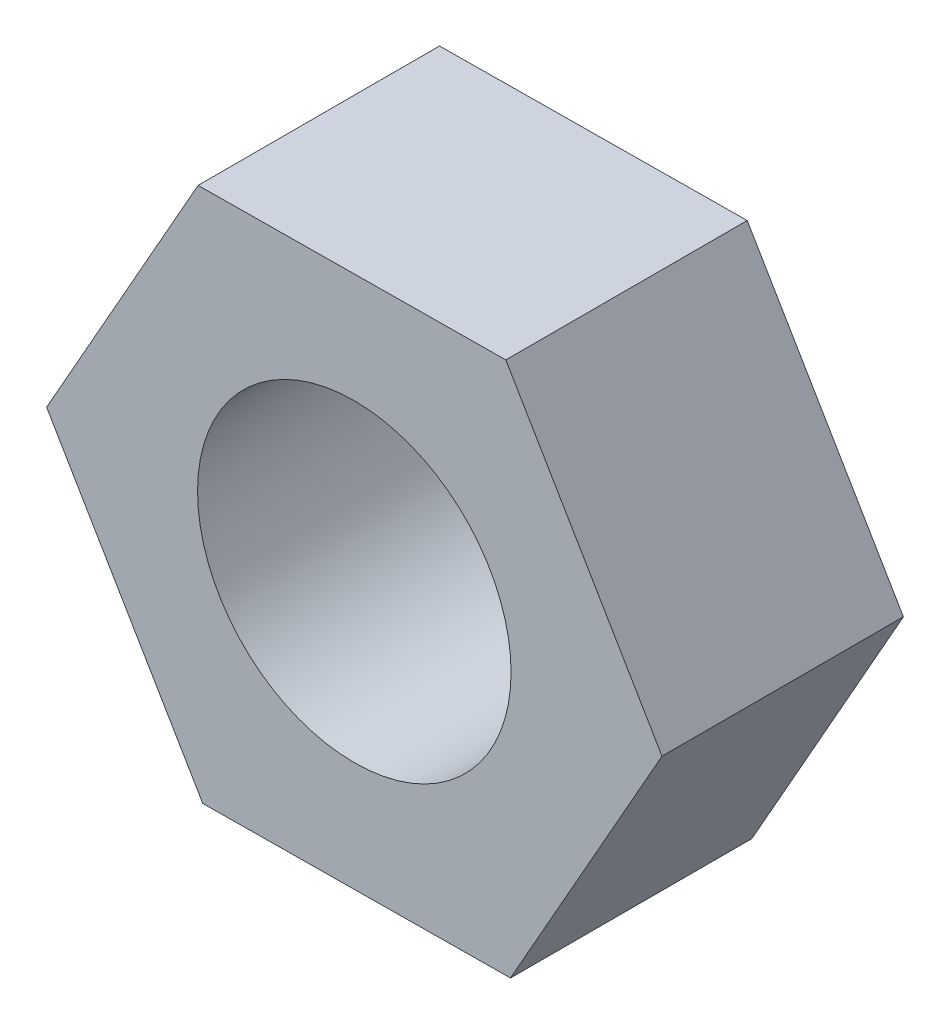
ISO-10303-21;
HEADER;
FILE_DESCRIPTION(('STEP AP214'),'2;1');
FILE_NAME('part.step','',(''),(''),'','','');
FILE_SCHEMA(('AUTOMOTIVE_DESIGN { 1 0 10303 214 1 1 1 1 }'));
ENDSEC;
DATA;
#1=APPLICATION_CONTEXT('core data for automotive mechanical design processes');
#2=APPLICATION_PROTOCOL_DEFINITION('international standard','automotive_design',2000,#1);
#3=PRODUCT_CONTEXT('',#1,'mechanical');
#4=PRODUCT('Part','Part','',(#3));
#5=PRODUCT_RELATED_PRODUCT_CATEGORY('part','',(#4));
#6=PRODUCT_DEFINITION_FORMATION('','',#4);
#7=PRODUCT_DEFINITION_CONTEXT('part definition',#1,'design');
#8=PRODUCT_DEFINITION('design','',#6,#7);
#9=PRODUCT_DEFINITION_SHAPE('','',#8);
#10=(LENGTH_UNIT() NAMED_UNIT(*) SI_UNIT(.MILLI.,.METRE.));
#11=(NAMED_UNIT(*) PLANE_ANGLE_UNIT() SI_UNIT($,.RADIAN.));
#12=(NAMED_UNIT(*) SI_UNIT($,.STERADIAN.) SOLID_ANGLE_UNIT());
#13=UNCERTAINTY_MEASURE_WITH_UNIT(LENGTH_MEASURE(1.E-05),#10,'distance_accuracy_value','');
#14=(GEOMETRIC_REPRESENTATION_CONTEXT(3) GLOBAL_UNCERTAINTY_ASSIGNED_CONTEXT((#13)) GLOBAL_UNIT_ASSIGNED_CONTEXT((#10,
#11,#12)) REPRESENTATION_CONTEXT('',''));
#15=CARTESIAN_POINT('',(0.,0.,0.));
#16=DIRECTION('',(0.,0.,1.));
#17=DIRECTION('',(1.,0.,0.));
#18=AXIS2_PLACEMENT_3D('',#15,#16,#17);
#19=CARTESIAN_POINT('',(0.,0.,7.7));
#20=DIRECTION('',(0.,0.,1.));
#21=DIRECTION('',(1.,0.,0.));
#22=AXIS2_PLACEMENT_3D('',#19,#20,#21);
#23=PLANE('',#22);
#24=DIRECTION('',(0.999961257640527,0.00880245522430738,0.));
#25=VECTOR('',#24,1.);
#26=CARTESIAN_POINT('',(-4.83246629145601,-8.54286853903739,7.7));
#27=LINE('',#26,#25);
#28=CARTESIAN_POINT('',(-4.83246629145601,-8.54286853903739,7.7));
#29=VERTEX_POINT('',#28);
#30=CARTESIAN_POINT('',(4.98210803026923,-8.45647284085157,7.7));
#31=VERTEX_POINT('',#30);
#32=EDGE_CURVE('E131',#29,#31,#27,.T.);
#33=ORIENTED_EDGE('',*,*,#32,.T.);
#34=DIRECTION('',(0.492357478980338,0.870393079529086,0.));
#35=VECTOR('',#34,1.);
#36=CARTESIAN_POINT('',(4.98210803026923,-8.45647284085157,7.7));
#37=LINE('',#36,#35);
#38=CARTESIAN_POINT('',(9.81457432172523,0.0863956981858203,7.7));
#39=VERTEX_POINT('',#38);
#40=EDGE_CURVE('E89',#31,#39,#37,.T.);
#41=ORIENTED_EDGE('',*,*,#40,.T.);
#42=DIRECTION('',(-0.507603778660189,0.861590624304779,0.));
#43=VECTOR('',#42,1.);
#44=CARTESIAN_POINT('',(9.81457432172523,0.0863956981858203,7.7));
#45=LINE('',#44,#43);
#46=CARTESIAN_POINT('',(4.83246629145601,8.54286853903739,7.7));
#47=VERTEX_POINT('',#46);
#48=EDGE_CURVE('E102',#39,#47,#45,.T.);
#49=ORIENTED_EDGE('',*,*,#48,.T.);
#50=DIRECTION('',(-0.999961257640527,-0.00880245522430721,0.));
#51=VECTOR('',#50,1.);
#52=CARTESIAN_POINT('',(4.83246629145601,8.54286853903739,7.7));
#53=LINE('',#52,#51);
#54=CARTESIAN_POINT('',(-4.98210803026923,8.45647284085157,7.7));
#55=VERTEX_POINT('',#54);
#56=EDGE_CURVE('E96',#47,#55,#53,.T.);
#57=ORIENTED_EDGE('',*,*,#56,.T.);
#58=DIRECTION('',(-0.492357478980338,-0.870393079529086,0.));
#59=VECTOR('',#58,1.);
#60=CARTESIAN_POINT('',(-4.98210803026923,8.45647284085157,7.7));
#61=LINE('',#60,#59);
#62=CARTESIAN_POINT('',(-9.81457432172523,-0.0863956981858203,7.7));
#63=VERTEX_POINT('',#62);
#64=EDGE_CURVE('E100',#55,#63,#61,.T.);
#65=ORIENTED_EDGE('',*,*,#64,.T.);
#66=DIRECTION('',(0.507603778660189,-0.861590624304779,0.));
#67=VECTOR('',#66,1.);
#68=CARTESIAN_POINT('',(-9.81457432172523,-0.0863956981858203,7.7));
#69=LINE('',#68,#67);
#70=EDGE_CURVE('E52',#63,#29,#69,.T.);
#71=ORIENTED_EDGE('',*,*,#70,.T.);
#72=EDGE_LOOP('',(#33,#41,#49,#57,#65,#71));
#73=FACE_BOUND('',#72,.T.);
#74=CARTESIAN_POINT('',(0.,0.,7.7));
#75=DIRECTION('',(0.,0.,1.));
#76=DIRECTION('',(1.,0.,0.));
#77=AXIS2_PLACEMENT_3D('',#74,#75,#76);
#78=CIRCLE('',#77,5.);
#79=CARTESIAN_POINT('',(-5.,0.,7.7));
#80=VERTEX_POINT('',#79);
#81=EDGE_CURVE('E124',#80,#80,#78,.T.);
#82=ORIENTED_EDGE('',*,*,#81,.F.);
#83=EDGE_LOOP('',(#82));
#84=FACE_BOUND('',#83,.T.);
#85=ADVANCED_FACE('F35',(#73,#84),#23,.T.);
#86=CARTESIAN_POINT('',(0.,0.,0.));
#87=DIRECTION('',(0.,0.,1.));
#88=DIRECTION('',(1.,0.,0.));
#89=AXIS2_PLACEMENT_3D('',#86,#87,#88);
#90=PLANE('',#89);
#91=DIRECTION('',(0.999961257640527,0.00880245522430738,0.));
#92=VECTOR('',#91,1.);
#93=CARTESIAN_POINT('',(-4.83246629145601,-8.54286853903739,0.));
#94=LINE('',#93,#92);
#95=CARTESIAN_POINT('',(-4.83246629145601,-8.54286853903739,0.));
#96=VERTEX_POINT('',#95);
#97=CARTESIAN_POINT('',(4.98210803026923,-8.45647284085157,0.));
#98=VERTEX_POINT('',#97);
#99=EDGE_CURVE('E120',#96,#98,#94,.T.);
#100=ORIENTED_EDGE('',*,*,#99,.F.);
#101=DIRECTION('',(0.507603778660189,-0.861590624304779,0.));
#102=VECTOR('',#101,1.);
#103=CARTESIAN_POINT('',(-9.81457432172523,-0.0863956981858203,0.));
#104=LINE('',#103,#102);
#105=CARTESIAN_POINT('',(-9.81457432172523,-0.0863956981858203,0.));
#106=VERTEX_POINT('',#105);
#107=EDGE_CURVE('E81',#106,#96,#104,.T.);
#108=ORIENTED_EDGE('',*,*,#107,.F.);
#109=DIRECTION('',(-0.492357478980338,-0.870393079529086,0.));
#110=VECTOR('',#109,1.);
#111=CARTESIAN_POINT('',(-4.98210803026923,8.45647284085157,0.));
#112=LINE('',#111,#110);
#113=CARTESIAN_POINT('',(-4.98210803026923,8.45647284085157,0.));
#114=VERTEX_POINT('',#113);
#115=EDGE_CURVE('E75',#114,#106,#112,.T.);
#116=ORIENTED_EDGE('',*,*,#115,.F.);
#117=DIRECTION('',(-0.999961257640527,-0.00880245522430721,0.));
#118=VECTOR('',#117,1.);
#119=CARTESIAN_POINT('',(4.83246629145601,8.54286853903739,0.));
#120=LINE('',#119,#118);
#121=CARTESIAN_POINT('',(4.83246629145601,8.54286853903739,0.));
#122=VERTEX_POINT('',#121);
#123=EDGE_CURVE('E110',#122,#114,#120,.T.);
#124=ORIENTED_EDGE('',*,*,#123,.F.);
#125=DIRECTION('',(-0.507603778660189,0.861590624304779,0.));
#126=VECTOR('',#125,1.);
#127=CARTESIAN_POINT('',(9.81457432172523,0.0863956981858203,0.));
#128=LINE('',#127,#126);
#129=CARTESIAN_POINT('',(9.81457432172523,0.0863956981858203,0.));
#130=VERTEX_POINT('',#129);
#131=EDGE_CURVE('E126',#130,#122,#128,.T.);
#132=ORIENTED_EDGE('',*,*,#131,.F.);
#133=DIRECTION('',(0.492357478980338,0.870393079529086,0.));
#134=VECTOR('',#133,1.);
#135=CARTESIAN_POINT('',(4.98210803026923,-8.45647284085157,0.));
#136=LINE('',#135,#134);
#137=EDGE_CURVE('E123',#98,#130,#136,.T.);
#138=ORIENTED_EDGE('',*,*,#137,.F.);
#139=EDGE_LOOP('',(#100,#108,#116,#124,#132,#138));
#140=FACE_BOUND('',#139,.T.);
#141=CARTESIAN_POINT('',(0.,0.,0.));
#142=DIRECTION('',(0.,0.,1.));
#143=DIRECTION('',(1.,0.,0.));
#144=AXIS2_PLACEMENT_3D('',#141,#142,#143);
#145=CIRCLE('',#144,5.);
#146=CARTESIAN_POINT('',(-5.,0.,0.));
#147=VERTEX_POINT('',#146);
#148=EDGE_CURVE('E224',#147,#147,#145,.T.);
#149=ORIENTED_EDGE('',*,*,#148,.T.);
#150=EDGE_LOOP('',(#149));
#151=FACE_BOUND('',#150,.T.);
#152=ADVANCED_FACE('F140',(#140,#151),#90,.F.);
#153=CARTESIAN_POINT('',(-4.83246629145601,-8.54286853903739,7.7));
#154=DIRECTION('',(-0.00880245522430738,0.999961257640527,0.));
#155=DIRECTION('',(-0.999961257640527,-0.00880245522430738,0.));
#156=AXIS2_PLACEMENT_3D('',#153,#154,#155);
#157=PLANE('',#156);
#158=ORIENTED_EDGE('',*,*,#99,.T.);
#159=DIRECTION('',(0.,0.,-1.));
#160=VECTOR('',#159,1.);
#161=CARTESIAN_POINT('',(4.98210803026923,-8.45647284085157,7.7));
#162=LINE('',#161,#160);
#163=EDGE_CURVE('E11',#31,#98,#162,.T.);
#164=ORIENTED_EDGE('',*,*,#163,.F.);
#165=ORIENTED_EDGE('',*,*,#32,.F.);
#166=DIRECTION('',(0.,0.,-1.));
#167=VECTOR('',#166,1.);
#168=CARTESIAN_POINT('',(-4.83246629145601,-8.54286853903739,7.7));
#169=LINE('',#168,#167);
#170=EDGE_CURVE('E116',#29,#96,#169,.T.);
#171=ORIENTED_EDGE('',*,*,#170,.T.);
#172=EDGE_LOOP('',(#158,#164,#165,#171));
#173=FACE_BOUND('',#172,.T.);
#174=ADVANCED_FACE('F37',(#173),#157,.F.);
#175=CARTESIAN_POINT('',(4.98210803026923,-8.45647284085157,7.7));
#176=DIRECTION('',(-0.870393079529086,0.492357478980338,0.));
#177=DIRECTION('',(-0.492357478980338,-0.870393079529086,0.));
#178=AXIS2_PLACEMENT_3D('',#175,#176,#177);
#179=PLANE('',#178);
#180=ORIENTED_EDGE('',*,*,#137,.T.);
#181=DIRECTION('',(0.,0.,-1.));
#182=VECTOR('',#181,1.);
#183=CARTESIAN_POINT('',(9.81457432172523,0.0863956981858203,7.7));
#184=LINE('',#183,#182);
#185=EDGE_CURVE('E44',#39,#130,#184,.T.);
#186=ORIENTED_EDGE('',*,*,#185,.F.);
#187=ORIENTED_EDGE('',*,*,#40,.F.);
#188=ORIENTED_EDGE('',*,*,#163,.T.);
#189=EDGE_LOOP('',(#180,#186,#187,#188));
#190=FACE_BOUND('',#189,.T.);
#191=ADVANCED_FACE('F165',(#190),#179,.F.);
#192=CARTESIAN_POINT('',(9.81457432172523,0.0863956981858203,7.7));
#193=DIRECTION('',(-0.861590624304779,-0.507603778660189,0.));
#194=DIRECTION('',(0.507603778660189,-0.861590624304779,0.));
#195=AXIS2_PLACEMENT_3D('',#192,#193,#194);
#196=PLANE('',#195);
#197=ORIENTED_EDGE('',*,*,#131,.T.);
#198=DIRECTION('',(0.,0.,-1.));
#199=VECTOR('',#198,1.);
#200=CARTESIAN_POINT('',(4.83246629145601,8.54286853903739,7.7));
#201=LINE('',#200,#199);
#202=EDGE_CURVE('E111',#47,#122,#201,.T.);
#203=ORIENTED_EDGE('',*,*,#202,.F.);
#204=ORIENTED_EDGE('',*,*,#48,.F.);
#205=ORIENTED_EDGE('',*,*,#185,.T.);
#206=EDGE_LOOP('',(#197,#203,#204,#205));
#207=FACE_BOUND('',#206,.T.);
#208=ADVANCED_FACE('F137',(#207),#196,.F.);
#209=CARTESIAN_POINT('',(4.83246629145601,8.54286853903739,7.7));
#210=DIRECTION('',(0.00880245522430721,-0.999961257640527,0.));
#211=DIRECTION('',(0.999961257640527,0.00880245522430721,0.));
#212=AXIS2_PLACEMENT_3D('',#209,#210,#211);
#213=PLANE('',#212);
#214=ORIENTED_EDGE('',*,*,#123,.T.);
#215=DIRECTION('',(0.,0.,-1.));
#216=VECTOR('',#215,1.);
#217=CARTESIAN_POINT('',(-4.98210803026923,8.45647284085157,7.7));
#218=LINE('',#217,#216);
#219=EDGE_CURVE('E107',#55,#114,#218,.T.);
#220=ORIENTED_EDGE('',*,*,#219,.F.);
#221=ORIENTED_EDGE('',*,*,#56,.F.);
#222=ORIENTED_EDGE('',*,*,#202,.T.);
#223=EDGE_LOOP('',(#214,#220,#221,#222));
#224=FACE_BOUND('',#223,.T.);
#225=ADVANCED_FACE('F108',(#224),#213,.F.);
#226=CARTESIAN_POINT('',(-4.98210803026923,8.45647284085157,7.7));
#227=DIRECTION('',(0.870393079529086,-0.492357478980338,0.));
#228=DIRECTION('',(0.492357478980338,0.870393079529086,0.));
#229=AXIS2_PLACEMENT_3D('',#226,#227,#228);
#230=PLANE('',#229);
#231=ORIENTED_EDGE('',*,*,#115,.T.);
#232=DIRECTION('',(0.,0.,-1.));
#233=VECTOR('',#232,1.);
#234=CARTESIAN_POINT('',(-9.81457432172523,-0.0863956981858203,7.7));
#235=LINE('',#234,#233);
#236=EDGE_CURVE('E112',#63,#106,#235,.T.);
#237=ORIENTED_EDGE('',*,*,#236,.F.);
#238=ORIENTED_EDGE('',*,*,#64,.F.);
#239=ORIENTED_EDGE('',*,*,#219,.T.);
#240=EDGE_LOOP('',(#231,#237,#238,#239));
#241=FACE_BOUND('',#240,.T.);
#242=ADVANCED_FACE('F114',(#241),#230,.F.);
#243=CARTESIAN_POINT('',(-9.81457432172523,-0.0863956981858203,7.7));
#244=DIRECTION('',(0.861590624304779,0.507603778660189,0.));
#245=DIRECTION('',(-0.507603778660189,0.861590624304779,0.));
#246=AXIS2_PLACEMENT_3D('',#243,#244,#245);
#247=PLANE('',#246);
#248=ORIENTED_EDGE('',*,*,#107,.T.);
#249=ORIENTED_EDGE('',*,*,#170,.F.);
#250=ORIENTED_EDGE('',*,*,#70,.F.);
#251=ORIENTED_EDGE('',*,*,#236,.T.);
#252=EDGE_LOOP('',(#248,#249,#250,#251));
#253=FACE_BOUND('',#252,.T.);
#254=ADVANCED_FACE('F145',(#253),#247,.F.);
#255=CARTESIAN_POINT('',(0.,0.,7.7));
#256=DIRECTION('',(0.,0.,-1.));
#257=DIRECTION('',(-1.,0.,0.));
#258=AXIS2_PLACEMENT_3D('',#255,#256,#257);
#259=CYLINDRICAL_SURFACE('',#258,5.);
#260=CARTESIAN_POINT('',(-5.,0.,7.7));
#261=CARTESIAN_POINT('',(-5.,0.,7.61979166666667));
#262=CARTESIAN_POINT('',(-5.,0.,7.53958333333333));
#263=CARTESIAN_POINT('',(-5.,0.,7.37916666666667));
#264=CARTESIAN_POINT('',(-5.,0.,7.29895833333333));
#265=CARTESIAN_POINT('',(-5.,0.,7.13854166666667));
#266=CARTESIAN_POINT('',(-5.,0.,7.05833333333333));
#267=CARTESIAN_POINT('',(-5.,0.,6.89791666666667));
#268=CARTESIAN_POINT('',(-5.,0.,6.81770833333333));
#269=CARTESIAN_POINT('',(-5.,0.,6.65729166666667));
#270=CARTESIAN_POINT('',(-5.,0.,6.57708333333333));
#271=CARTESIAN_POINT('',(-5.,0.,6.41666666666667));
#272=CARTESIAN_POINT('',(-5.,0.,6.33645833333333));
#273=CARTESIAN_POINT('',(-5.,0.,6.17604166666667));
#274=CARTESIAN_POINT('',(-5.,0.,6.09583333333333));
#275=CARTESIAN_POINT('',(-5.,0.,5.93541666666667));
#276=CARTESIAN_POINT('',(-5.,0.,5.85520833333333));
#277=CARTESIAN_POINT('',(-5.,0.,5.69479166666667));
#278=CARTESIAN_POINT('',(-5.,0.,5.61458333333333));
#279=CARTESIAN_POINT('',(-5.,0.,5.45416666666667));
#280=CARTESIAN_POINT('',(-5.,0.,5.37395833333333));
#281=CARTESIAN_POINT('',(-5.,0.,5.21354166666667));
#282=CARTESIAN_POINT('',(-5.,0.,5.13333333333333));
#283=CARTESIAN_POINT('',(-5.,0.,4.97291666666667));
#284=CARTESIAN_POINT('',(-5.,0.,4.89270833333333));
#285=CARTESIAN_POINT('',(-5.,0.,4.73229166666667));
#286=CARTESIAN_POINT('',(-5.,0.,4.65208333333333));
#287=CARTESIAN_POINT('',(-5.,0.,4.49166666666667));
#288=CARTESIAN_POINT('',(-5.,0.,4.41145833333333));
#289=CARTESIAN_POINT('',(-5.,0.,4.25104166666667));
#290=CARTESIAN_POINT('',(-5.,0.,4.17083333333333));
#291=CARTESIAN_POINT('',(-5.,0.,4.01041666666667));
#292=CARTESIAN_POINT('',(-5.,0.,3.93020833333333));
#293=CARTESIAN_POINT('',(-5.,0.,3.76979166666667));
#294=CARTESIAN_POINT('',(-5.,0.,3.68958333333333));
#295=CARTESIAN_POINT('',(-5.,0.,3.52916666666667));
#296=CARTESIAN_POINT('',(-5.,0.,3.44895833333333));
#297=CARTESIAN_POINT('',(-5.,0.,3.28854166666667));
#298=CARTESIAN_POINT('',(-5.,0.,3.20833333333333));
#299=CARTESIAN_POINT('',(-5.,0.,3.04791666666667));
#300=CARTESIAN_POINT('',(-5.,0.,2.96770833333333));
#301=CARTESIAN_POINT('',(-5.,0.,2.80729166666667));
#302=CARTESIAN_POINT('',(-5.,0.,2.72708333333333));
#303=CARTESIAN_POINT('',(-5.,0.,2.56666666666667));
#304=CARTESIAN_POINT('',(-5.,0.,2.48645833333333));
#305=CARTESIAN_POINT('',(-5.,0.,2.32604166666667));
#306=CARTESIAN_POINT('',(-5.,0.,2.24583333333333));
#307=CARTESIAN_POINT('',(-5.,0.,2.08541666666667));
#308=CARTESIAN_POINT('',(-5.,0.,2.00520833333333));
#309=CARTESIAN_POINT('',(-5.,0.,1.84479166666667));
#310=CARTESIAN_POINT('',(-5.,0.,1.76458333333333));
#311=CARTESIAN_POINT('',(-5.,0.,1.60416666666667));
#312=CARTESIAN_POINT('',(-5.,0.,1.52395833333333));
#313=CARTESIAN_POINT('',(-5.,0.,1.36354166666667));
#314=CARTESIAN_POINT('',(-5.,0.,1.28333333333333));
#315=CARTESIAN_POINT('',(-5.,0.,1.12291666666667));
#316=CARTESIAN_POINT('',(-5.,0.,1.04270833333333));
#317=CARTESIAN_POINT('',(-5.,0.,0.882291666666666));
#318=CARTESIAN_POINT('',(-5.,0.,0.802083333333333));
#319=CARTESIAN_POINT('',(-5.,0.,0.641666666666666));
#320=CARTESIAN_POINT('',(-5.,0.,0.561458333333332));
#321=CARTESIAN_POINT('',(-5.,0.,0.401041666666666));
#322=CARTESIAN_POINT('',(-5.,0.,0.320833333333333));
#323=CARTESIAN_POINT('',(-5.,0.,0.160416666666666));
#324=CARTESIAN_POINT('',(-5.,0.,0.0802083333333325));
#325=CARTESIAN_POINT('',(-5.,0.,0.));
#326=B_SPLINE_CURVE_WITH_KNOTS('',3,(#260,#261,#262,#263,#264,#265,#266,#267,#268,#269,#270,
#271,#272,#273,#274,#275,#276,#277,#278,#279,#280,#281,#282,#283,#284,#285,#286,#287,#288,#289,
#290,#291,#292,#293,#294,#295,#296,#297,#298,#299,#300,#301,#302,#303,#304,#305,#306,#307,#308,
#309,#310,#311,#312,#313,#314,#315,#316,#317,#318,#319,#320,#321,#322,#323,#324,#325),
.UNSPECIFIED.,.F.,.F.,(4,2,2,2,2,2,2,2,2,2,2,2,2,2,2,2,2,2,2,2,2,2,2,2,2,2,2,2,2,2,2,2,4),(0.,
0.240625,0.48125,0.721874999999999,0.9625,1.203125,1.44375,1.684375,1.925,2.165625,2.40625,
2.646875,2.8875,3.128125,3.36875,3.609375,3.85,4.090625,4.33125,4.571875,4.8125,5.053125,
5.29375,5.534375,5.775,6.015625,6.25625,6.496875,6.7375,6.978125,7.21875,7.459375,7.7),.UNSPECIFIED.);
#327=EDGE_CURVE('BSEAM147',#80,#147,#326,.T.);
#328=ORIENTED_EDGE('',*,*,#81,.T.);
#329=ORIENTED_EDGE('',*,*,#148,.F.);
#330=ORIENTED_EDGE('',*,*,#327,.T.);
#331=ORIENTED_EDGE('',*,*,#327,.F.);
#332=EDGE_LOOP('',(#328,#330,#329,#331));
#333=FACE_BOUND('',#332,.T.);
#334=ADVANCED_FACE('F147',(#333),#259,.F.);
#335=CLOSED_SHELL('',(#85,#152,#174,#191,#208,#225,#242,#254,#334));
#336=MANIFOLD_SOLID_BREP('B2',#335);
#337=ADVANCED_BREP_SHAPE_REPRESENTATION('',(#18,#336),#14);
#338=SHAPE_DEFINITION_REPRESENTATION(#9,#337);
ENDSEC;
END-ISO-10303-21;
